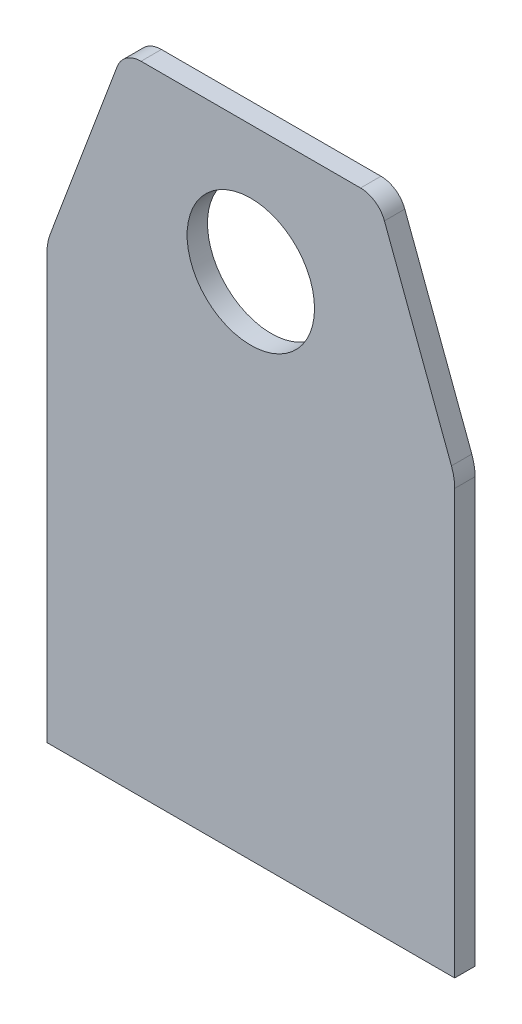
ISO-10303-21;
HEADER;
FILE_DESCRIPTION(('STEP AP214'),'2;1');
FILE_NAME('part.step','',(''),(''),'','','');
FILE_SCHEMA(('AUTOMOTIVE_DESIGN { 1 0 10303 214 1 1 1 1 }'));
ENDSEC;
DATA;
#1=APPLICATION_CONTEXT('core data for automotive mechanical design processes');
#2=APPLICATION_PROTOCOL_DEFINITION('international standard','automotive_design',2000,#1);
#3=PRODUCT_CONTEXT('',#1,'mechanical');
#4=PRODUCT('Part','Part','',(#3));
#5=PRODUCT_RELATED_PRODUCT_CATEGORY('part','',(#4));
#6=PRODUCT_DEFINITION_FORMATION('','',#4);
#7=PRODUCT_DEFINITION_CONTEXT('part definition',#1,'design');
#8=PRODUCT_DEFINITION('design','',#6,#7);
#9=PRODUCT_DEFINITION_SHAPE('','',#8);
#10=(LENGTH_UNIT() NAMED_UNIT(*) SI_UNIT(.MILLI.,.METRE.));
#11=(NAMED_UNIT(*) PLANE_ANGLE_UNIT() SI_UNIT($,.RADIAN.));
#12=(NAMED_UNIT(*) SI_UNIT($,.STERADIAN.) SOLID_ANGLE_UNIT());
#13=UNCERTAINTY_MEASURE_WITH_UNIT(LENGTH_MEASURE(1.E-05),#10,'distance_accuracy_value','');
#14=(GEOMETRIC_REPRESENTATION_CONTEXT(3) GLOBAL_UNCERTAINTY_ASSIGNED_CONTEXT((#13)) GLOBAL_UNIT_ASSIGNED_CONTEXT((#10,
#11,#12)) REPRESENTATION_CONTEXT('',''));
#15=CARTESIAN_POINT('',(0.,0.,0.));
#16=DIRECTION('',(0.,0.,1.));
#17=DIRECTION('',(1.,0.,0.));
#18=AXIS2_PLACEMENT_3D('',#15,#16,#17);
#19=CARTESIAN_POINT('',(80.,0.,8.));
#20=DIRECTION('',(0.,1.,0.));
#21=DIRECTION('',(0.,0.,1.));
#22=AXIS2_PLACEMENT_3D('',#19,#20,#21);
#23=PLANE('',#22);
#24=DIRECTION('',(1.,0.,0.));
#25=VECTOR('',#24,1.);
#26=CARTESIAN_POINT('',(80.,0.,0.));
#27=LINE('',#26,#25);
#28=CARTESIAN_POINT('',(-80.,0.,0.));
#29=VERTEX_POINT('',#28);
#30=CARTESIAN_POINT('',(80.,0.,0.));
#31=VERTEX_POINT('',#30);
#32=EDGE_CURVE('E145',#29,#31,#27,.T.);
#33=ORIENTED_EDGE('',*,*,#32,.T.);
#34=DIRECTION('',(0.,0.,-1.));
#35=VECTOR('',#34,1.);
#36=CARTESIAN_POINT('',(80.,0.,8.));
#37=LINE('',#36,#35);
#38=CARTESIAN_POINT('',(80.,0.,8.));
#39=VERTEX_POINT('',#38);
#40=EDGE_CURVE('E124',#39,#31,#37,.T.);
#41=ORIENTED_EDGE('',*,*,#40,.F.);
#42=DIRECTION('',(1.,0.,0.));
#43=VECTOR('',#42,1.);
#44=CARTESIAN_POINT('',(80.,0.,8.));
#45=LINE('',#44,#43);
#46=CARTESIAN_POINT('',(-80.,0.,8.));
#47=VERTEX_POINT('',#46);
#48=EDGE_CURVE('E132',#47,#39,#45,.T.);
#49=ORIENTED_EDGE('',*,*,#48,.F.);
#50=DIRECTION('',(0.,0.,-1.));
#51=VECTOR('',#50,1.);
#52=CARTESIAN_POINT('',(-80.,0.,8.));
#53=LINE('',#52,#51);
#54=EDGE_CURVE('E148',#47,#29,#53,.T.);
#55=ORIENTED_EDGE('',*,*,#54,.T.);
#56=EDGE_LOOP('',(#33,#41,#49,#55));
#57=FACE_BOUND('',#56,.T.);
#58=ADVANCED_FACE('F39',(#57),#23,.F.);
#59=CARTESIAN_POINT('',(80.,0.,8.));
#60=DIRECTION('',(-1.,0.,0.));
#61=DIRECTION('',(0.,0.,1.));
#62=AXIS2_PLACEMENT_3D('',#59,#60,#61);
#63=PLANE('',#62);
#64=DIRECTION('',(0.,1.,0.));
#65=VECTOR('',#64,1.);
#66=CARTESIAN_POINT('',(80.,0.,0.));
#67=LINE('',#66,#65);
#68=CARTESIAN_POINT('',(80.,166.37330836455,0.));
#69=VERTEX_POINT('',#68);
#70=EDGE_CURVE('E226',#31,#69,#67,.T.);
#71=ORIENTED_EDGE('',*,*,#70,.T.);
#72=DIRECTION('',(0.,0.,-1.));
#73=VECTOR('',#72,1.);
#74=CARTESIAN_POINT('',(80.,166.37330836455,8.));
#75=LINE('',#74,#73);
#76=CARTESIAN_POINT('',(80.,166.37330836455,8.));
#77=VERTEX_POINT('',#76);
#78=EDGE_CURVE('E127',#69,#77,#75,.F.);
#79=ORIENTED_EDGE('',*,*,#78,.T.);
#80=DIRECTION('',(0.,1.,0.));
#81=VECTOR('',#80,1.);
#82=CARTESIAN_POINT('',(80.,0.,8.));
#83=LINE('',#82,#81);
#84=EDGE_CURVE('E119',#39,#77,#83,.T.);
#85=ORIENTED_EDGE('',*,*,#84,.F.);
#86=ORIENTED_EDGE('',*,*,#40,.T.);
#87=EDGE_LOOP('',(#71,#79,#85,#86));
#88=FACE_BOUND('',#87,.T.);
#89=ADVANCED_FACE('F122',(#88),#63,.F.);
#90=CARTESIAN_POINT('',(80.,170.,8.));
#91=DIRECTION('',(-0.936329177569045,-0.351123441588392,0.));
#92=DIRECTION('',(0.351123441588392,-0.936329177569045,0.));
#93=AXIS2_PLACEMENT_3D('',#90,#91,#92);
#94=PLANE('',#93);
#95=DIRECTION('',(-0.351123441588392,0.936329177569044,0.));
#96=VECTOR('',#95,1.);
#97=CARTESIAN_POINT('',(80.,170.,0.));
#98=LINE('',#97,#96);
#99=CARTESIAN_POINT('',(78.7265835513809,173.395777196318,0.));
#100=VERTEX_POINT('',#99);
#101=CARTESIAN_POINT('',(52.4332870940435,243.511234415884,0.));
#102=VERTEX_POINT('',#101);
#103=EDGE_CURVE('E221',#100,#102,#98,.T.);
#104=ORIENTED_EDGE('',*,*,#103,.T.);
#105=DIRECTION('',(0.,0.,-1.));
#106=VECTOR('',#105,1.);
#107=CARTESIAN_POINT('',(52.4332870940435,243.511234415884,8.));
#108=LINE('',#107,#106);
#109=CARTESIAN_POINT('',(52.4332870940435,243.511234415884,8.));
#110=VERTEX_POINT('',#109);
#111=EDGE_CURVE('E11',#102,#110,#108,.F.);
#112=ORIENTED_EDGE('',*,*,#111,.T.);
#113=DIRECTION('',(-0.351123441588392,0.936329177569044,0.));
#114=VECTOR('',#113,1.);
#115=CARTESIAN_POINT('',(80.,170.,8.));
#116=LINE('',#115,#114);
#117=CARTESIAN_POINT('',(78.7265835513809,173.395777196318,8.));
#118=VERTEX_POINT('',#117);
#119=EDGE_CURVE('E131',#118,#110,#116,.T.);
#120=ORIENTED_EDGE('',*,*,#119,.F.);
#121=DIRECTION('',(0.,0.,-1.));
#122=VECTOR('',#121,1.);
#123=CARTESIAN_POINT('',(78.7265835513809,173.395777196318,8.));
#124=LINE('',#123,#122);
#125=EDGE_CURVE('E168',#118,#100,#124,.T.);
#126=ORIENTED_EDGE('',*,*,#125,.T.);
#127=EDGE_LOOP('',(#104,#112,#120,#126));
#128=FACE_BOUND('',#127,.T.);
#129=ADVANCED_FACE('F270',(#128),#94,.F.);
#130=CARTESIAN_POINT('',(-50.,250.,8.));
#131=DIRECTION('',(0.,-1.,0.));
#132=DIRECTION('',(0.,0.,-1.));
#133=AXIS2_PLACEMENT_3D('',#130,#131,#132);
#134=PLANE('',#133);
#135=DIRECTION('',(-1.,0.,0.));
#136=VECTOR('',#135,1.);
#137=CARTESIAN_POINT('',(-50.,250.,0.));
#138=LINE('',#137,#136);
#139=CARTESIAN_POINT('',(43.0699953183531,250.,0.));
#140=VERTEX_POINT('',#139);
#141=CARTESIAN_POINT('',(-43.0699953183531,250.,0.));
#142=VERTEX_POINT('',#141);
#143=EDGE_CURVE('E216',#140,#142,#138,.T.);
#144=ORIENTED_EDGE('',*,*,#143,.T.);
#145=DIRECTION('',(0.,0.,-1.));
#146=VECTOR('',#145,1.);
#147=CARTESIAN_POINT('',(-43.0699953183531,250.,8.));
#148=LINE('',#147,#146);
#149=CARTESIAN_POINT('',(-43.0699953183531,250.,8.));
#150=VERTEX_POINT('',#149);
#151=EDGE_CURVE('E61',#142,#150,#148,.F.);
#152=ORIENTED_EDGE('',*,*,#151,.T.);
#153=DIRECTION('',(-1.,0.,0.));
#154=VECTOR('',#153,1.);
#155=CARTESIAN_POINT('',(-50.,250.,8.));
#156=LINE('',#155,#154);
#157=CARTESIAN_POINT('',(43.0699953183531,250.,8.));
#158=VERTEX_POINT('',#157);
#159=EDGE_CURVE('E202',#158,#150,#156,.T.);
#160=ORIENTED_EDGE('',*,*,#159,.F.);
#161=DIRECTION('',(0.,0.,-1.));
#162=VECTOR('',#161,1.);
#163=CARTESIAN_POINT('',(43.0699953183531,250.,8.));
#164=LINE('',#163,#162);
#165=EDGE_CURVE('E190',#158,#140,#164,.T.);
#166=ORIENTED_EDGE('',*,*,#165,.T.);
#167=EDGE_LOOP('',(#144,#152,#160,#166));
#168=FACE_BOUND('',#167,.T.);
#169=ADVANCED_FACE('F218',(#168),#134,.F.);
#170=CARTESIAN_POINT('',(-80.,170.,8.));
#171=DIRECTION('',(0.936329177569045,-0.351123441588392,0.));
#172=DIRECTION('',(0.351123441588392,0.936329177569045,0.));
#173=AXIS2_PLACEMENT_3D('',#170,#171,#172);
#174=PLANE('',#173);
#175=DIRECTION('',(-0.351123441588392,-0.936329177569044,0.));
#176=VECTOR('',#175,1.);
#177=CARTESIAN_POINT('',(-80.,170.,8.));
#178=LINE('',#177,#176);
#179=CARTESIAN_POINT('',(-52.4332870940435,243.511234415884,8.));
#180=VERTEX_POINT('',#179);
#181=CARTESIAN_POINT('',(-78.7265835513809,173.395777196318,8.));
#182=VERTEX_POINT('',#181);
#183=EDGE_CURVE('E201',#180,#182,#178,.T.);
#184=ORIENTED_EDGE('',*,*,#183,.F.);
#185=DIRECTION('',(0.,0.,-1.));
#186=VECTOR('',#185,1.);
#187=CARTESIAN_POINT('',(-52.4332870940435,243.511234415884,8.));
#188=LINE('',#187,#186);
#189=CARTESIAN_POINT('',(-52.4332870940435,243.511234415884,0.));
#190=VERTEX_POINT('',#189);
#191=EDGE_CURVE('E180',#180,#190,#188,.T.);
#192=ORIENTED_EDGE('',*,*,#191,.T.);
#193=DIRECTION('',(-0.351123441588392,-0.936329177569044,0.));
#194=VECTOR('',#193,1.);
#195=CARTESIAN_POINT('',(-80.,170.,0.));
#196=LINE('',#195,#194);
#197=CARTESIAN_POINT('',(-78.7265835513809,173.395777196318,0.));
#198=VERTEX_POINT('',#197);
#199=EDGE_CURVE('E217',#190,#198,#196,.T.);
#200=ORIENTED_EDGE('',*,*,#199,.T.);
#201=DIRECTION('',(0.,0.,-1.));
#202=VECTOR('',#201,1.);
#203=CARTESIAN_POINT('',(-78.7265835513809,173.395777196318,8.));
#204=LINE('',#203,#202);
#205=EDGE_CURVE('E161',#198,#182,#204,.F.);
#206=ORIENTED_EDGE('',*,*,#205,.T.);
#207=EDGE_LOOP('',(#184,#192,#200,#206));
#208=FACE_BOUND('',#207,.T.);
#209=ADVANCED_FACE('F206',(#208),#174,.F.);
#210=CARTESIAN_POINT('',(-80.,0.,8.));
#211=DIRECTION('',(1.,0.,0.));
#212=DIRECTION('',(0.,0.,-1.));
#213=AXIS2_PLACEMENT_3D('',#210,#211,#212);
#214=PLANE('',#213);
#215=DIRECTION('',(0.,-1.,0.));
#216=VECTOR('',#215,1.);
#217=CARTESIAN_POINT('',(-80.,0.,8.));
#218=LINE('',#217,#216);
#219=CARTESIAN_POINT('',(-80.,166.37330836455,8.));
#220=VERTEX_POINT('',#219);
#221=EDGE_CURVE('E137',#220,#47,#218,.T.);
#222=ORIENTED_EDGE('',*,*,#221,.F.);
#223=DIRECTION('',(0.,0.,-1.));
#224=VECTOR('',#223,1.);
#225=CARTESIAN_POINT('',(-80.,166.37330836455,8.));
#226=LINE('',#225,#224);
#227=CARTESIAN_POINT('',(-80.,166.37330836455,0.));
#228=VERTEX_POINT('',#227);
#229=EDGE_CURVE('E147',#220,#228,#226,.T.);
#230=ORIENTED_EDGE('',*,*,#229,.T.);
#231=DIRECTION('',(0.,-1.,0.));
#232=VECTOR('',#231,1.);
#233=CARTESIAN_POINT('',(-80.,0.,0.));
#234=LINE('',#233,#232);
#235=EDGE_CURVE('E142',#228,#29,#234,.T.);
#236=ORIENTED_EDGE('',*,*,#235,.T.);
#237=ORIENTED_EDGE('',*,*,#54,.F.);
#238=EDGE_LOOP('',(#222,#230,#236,#237));
#239=FACE_BOUND('',#238,.T.);
#240=ADVANCED_FACE('F232',(#239),#214,.F.);
#241=CARTESIAN_POINT('',(0.,0.,8.));
#242=DIRECTION('',(0.,0.,-1.));
#243=DIRECTION('',(-1.,0.,0.));
#244=AXIS2_PLACEMENT_3D('',#241,#242,#243);
#245=PLANE('',#244);
#246=CARTESIAN_POINT('',(0.,200.,8.));
#247=DIRECTION('',(0.,0.,1.));
#248=DIRECTION('',(1.,0.,0.));
#249=AXIS2_PLACEMENT_3D('',#246,#247,#248);
#250=CIRCLE('',#249,25.);
#251=CARTESIAN_POINT('',(25.,200.,8.));
#252=VERTEX_POINT('',#251);
#253=EDGE_CURVE('E240',#252,#252,#250,.T.);
#254=ORIENTED_EDGE('',*,*,#253,.F.);
#255=EDGE_LOOP('',(#254));
#256=FACE_BOUND('',#255,.T.);
#257=ORIENTED_EDGE('',*,*,#159,.T.);
#258=CARTESIAN_POINT('',(-43.0699953183531,240.,8.));
#259=DIRECTION('',(0.,0.,-1.));
#260=DIRECTION('',(-1.,0.,0.));
#261=AXIS2_PLACEMENT_3D('',#258,#259,#260);
#262=CIRCLE('',#261,10.);
#263=EDGE_CURVE('E48',#150,#180,#262,.F.);
#264=ORIENTED_EDGE('',*,*,#263,.T.);
#265=ORIENTED_EDGE('',*,*,#183,.T.);
#266=CARTESIAN_POINT('',(-60.,166.37330836455,8.));
#267=DIRECTION('',(0.,0.,-1.));
#268=DIRECTION('',(-1.,0.,0.));
#269=AXIS2_PLACEMENT_3D('',#266,#267,#268);
#270=CIRCLE('',#269,20.);
#271=EDGE_CURVE('E165',#182,#220,#270,.F.);
#272=ORIENTED_EDGE('',*,*,#271,.T.);
#273=ORIENTED_EDGE('',*,*,#221,.T.);
#274=ORIENTED_EDGE('',*,*,#48,.T.);
#275=ORIENTED_EDGE('',*,*,#84,.T.);
#276=CARTESIAN_POINT('',(60.,166.37330836455,8.));
#277=DIRECTION('',(0.,0.,-1.));
#278=DIRECTION('',(-1.,0.,0.));
#279=AXIS2_PLACEMENT_3D('',#276,#277,#278);
#280=CIRCLE('',#279,20.);
#281=EDGE_CURVE('E177',#77,#118,#280,.F.);
#282=ORIENTED_EDGE('',*,*,#281,.T.);
#283=ORIENTED_EDGE('',*,*,#119,.T.);
#284=CARTESIAN_POINT('',(43.0699953183531,240.,8.));
#285=DIRECTION('',(0.,0.,-1.));
#286=DIRECTION('',(-1.,0.,0.));
#287=AXIS2_PLACEMENT_3D('',#284,#285,#286);
#288=CIRCLE('',#287,10.);
#289=EDGE_CURVE('E196',#110,#158,#288,.F.);
#290=ORIENTED_EDGE('',*,*,#289,.T.);
#291=EDGE_LOOP('',(#257,#264,#265,#272,#273,#274,#275,#282,#283,#290));
#292=FACE_BOUND('',#291,.T.);
#293=ADVANCED_FACE('F135',(#256,#292),#245,.F.);
#294=CARTESIAN_POINT('',(0.,0.,0.));
#295=DIRECTION('',(0.,0.,-1.));
#296=DIRECTION('',(-1.,0.,0.));
#297=AXIS2_PLACEMENT_3D('',#294,#295,#296);
#298=PLANE('',#297);
#299=CARTESIAN_POINT('',(0.,200.,0.));
#300=DIRECTION('',(0.,0.,1.));
#301=DIRECTION('',(1.,0.,0.));
#302=AXIS2_PLACEMENT_3D('',#299,#300,#301);
#303=CIRCLE('',#302,25.);
#304=CARTESIAN_POINT('',(25.,200.,0.));
#305=VERTEX_POINT('',#304);
#306=EDGE_CURVE('E235',#305,#305,#303,.T.);
#307=ORIENTED_EDGE('',*,*,#306,.T.);
#308=EDGE_LOOP('',(#307));
#309=FACE_BOUND('',#308,.T.);
#310=ORIENTED_EDGE('',*,*,#199,.F.);
#311=CARTESIAN_POINT('',(-43.0699953183531,240.,0.));
#312=DIRECTION('',(0.,0.,-1.));
#313=DIRECTION('',(-1.,0.,0.));
#314=AXIS2_PLACEMENT_3D('',#311,#312,#313);
#315=CIRCLE('',#314,10.);
#316=EDGE_CURVE('E187',#190,#142,#315,.T.);
#317=ORIENTED_EDGE('',*,*,#316,.T.);
#318=ORIENTED_EDGE('',*,*,#143,.F.);
#319=CARTESIAN_POINT('',(43.0699953183531,240.,0.));
#320=DIRECTION('',(0.,0.,-1.));
#321=DIRECTION('',(-1.,0.,0.));
#322=AXIS2_PLACEMENT_3D('',#319,#320,#321);
#323=CIRCLE('',#322,10.);
#324=EDGE_CURVE('E184',#140,#102,#323,.T.);
#325=ORIENTED_EDGE('',*,*,#324,.T.);
#326=ORIENTED_EDGE('',*,*,#103,.F.);
#327=CARTESIAN_POINT('',(60.,166.37330836455,0.));
#328=DIRECTION('',(0.,0.,-1.));
#329=DIRECTION('',(-1.,0.,0.));
#330=AXIS2_PLACEMENT_3D('',#327,#328,#329);
#331=CIRCLE('',#330,20.);
#332=EDGE_CURVE('E172',#100,#69,#331,.T.);
#333=ORIENTED_EDGE('',*,*,#332,.T.);
#334=ORIENTED_EDGE('',*,*,#70,.F.);
#335=ORIENTED_EDGE('',*,*,#32,.F.);
#336=ORIENTED_EDGE('',*,*,#235,.F.);
#337=CARTESIAN_POINT('',(-60.,166.37330836455,0.));
#338=DIRECTION('',(0.,0.,-1.));
#339=DIRECTION('',(-1.,0.,0.));
#340=AXIS2_PLACEMENT_3D('',#337,#338,#339);
#341=CIRCLE('',#340,20.);
#342=EDGE_CURVE('E153',#228,#198,#341,.T.);
#343=ORIENTED_EDGE('',*,*,#342,.T.);
#344=EDGE_LOOP('',(#310,#317,#318,#325,#326,#333,#334,#335,#336,#343));
#345=FACE_BOUND('',#344,.T.);
#346=ADVANCED_FACE('F215',(#309,#345),#298,.T.);
#347=CARTESIAN_POINT('',(0.,200.,0.));
#348=DIRECTION('',(0.,0.,1.));
#349=DIRECTION('',(1.,0.,0.));
#350=AXIS2_PLACEMENT_3D('',#347,#348,#349);
#351=CYLINDRICAL_SURFACE('',#350,25.);
#352=ORIENTED_EDGE('',*,*,#306,.F.);
#353=EDGE_LOOP('',(#352));
#354=FACE_BOUND('',#353,.T.);
#355=ORIENTED_EDGE('',*,*,#253,.T.);
#356=EDGE_LOOP('',(#355));
#357=FACE_BOUND('',#356,.T.);
#358=ADVANCED_FACE('F253',(#354,#357),#351,.F.);
#359=CARTESIAN_POINT('',(-60.,166.37330836455,8.));
#360=DIRECTION('',(0.,0.,-1.));
#361=DIRECTION('',(-1.,0.,0.));
#362=AXIS2_PLACEMENT_3D('',#359,#360,#361);
#363=CYLINDRICAL_SURFACE('',#362,20.);
#364=ORIENTED_EDGE('',*,*,#271,.F.);
#365=ORIENTED_EDGE('',*,*,#205,.F.);
#366=ORIENTED_EDGE('',*,*,#342,.F.);
#367=ORIENTED_EDGE('',*,*,#229,.F.);
#368=EDGE_LOOP('',(#364,#365,#366,#367));
#369=FACE_BOUND('',#368,.T.);
#370=ADVANCED_FACE('F274',(#369),#363,.T.);
#371=CARTESIAN_POINT('',(60.,166.37330836455,8.));
#372=DIRECTION('',(0.,0.,-1.));
#373=DIRECTION('',(-1.,0.,0.));
#374=AXIS2_PLACEMENT_3D('',#371,#372,#373);
#375=CYLINDRICAL_SURFACE('',#374,20.);
#376=ORIENTED_EDGE('',*,*,#281,.F.);
#377=ORIENTED_EDGE('',*,*,#78,.F.);
#378=ORIENTED_EDGE('',*,*,#332,.F.);
#379=ORIENTED_EDGE('',*,*,#125,.F.);
#380=EDGE_LOOP('',(#376,#377,#378,#379));
#381=FACE_BOUND('',#380,.T.);
#382=ADVANCED_FACE('F277',(#381),#375,.T.);
#383=CARTESIAN_POINT('',(-43.0699953183531,240.,8.));
#384=DIRECTION('',(0.,0.,-1.));
#385=DIRECTION('',(-1.,0.,0.));
#386=AXIS2_PLACEMENT_3D('',#383,#384,#385);
#387=CYLINDRICAL_SURFACE('',#386,10.);
#388=ORIENTED_EDGE('',*,*,#263,.F.);
#389=ORIENTED_EDGE('',*,*,#151,.F.);
#390=ORIENTED_EDGE('',*,*,#316,.F.);
#391=ORIENTED_EDGE('',*,*,#191,.F.);
#392=EDGE_LOOP('',(#388,#389,#390,#391));
#393=FACE_BOUND('',#392,.T.);
#394=ADVANCED_FACE('F212',(#393),#387,.T.);
#395=CARTESIAN_POINT('',(43.0699953183531,240.,8.));
#396=DIRECTION('',(0.,0.,-1.));
#397=DIRECTION('',(-1.,0.,0.));
#398=AXIS2_PLACEMENT_3D('',#395,#396,#397);
#399=CYLINDRICAL_SURFACE('',#398,10.);
#400=ORIENTED_EDGE('',*,*,#289,.F.);
#401=ORIENTED_EDGE('',*,*,#111,.F.);
#402=ORIENTED_EDGE('',*,*,#324,.F.);
#403=ORIENTED_EDGE('',*,*,#165,.F.);
#404=EDGE_LOOP('',(#400,#401,#402,#403));
#405=FACE_BOUND('',#404,.T.);
#406=ADVANCED_FACE('F41',(#405),#399,.T.);
#407=CLOSED_SHELL('',(#58,#89,#129,#169,#209,#240,#293,#346,#358,#370,#382,#394,#406));
#408=MANIFOLD_SOLID_BREP('B2',#407);
#409=ADVANCED_BREP_SHAPE_REPRESENTATION('',(#18,#408),#14);
#410=SHAPE_DEFINITION_REPRESENTATION(#9,#409);
ENDSEC;
END-ISO-10303-21;
